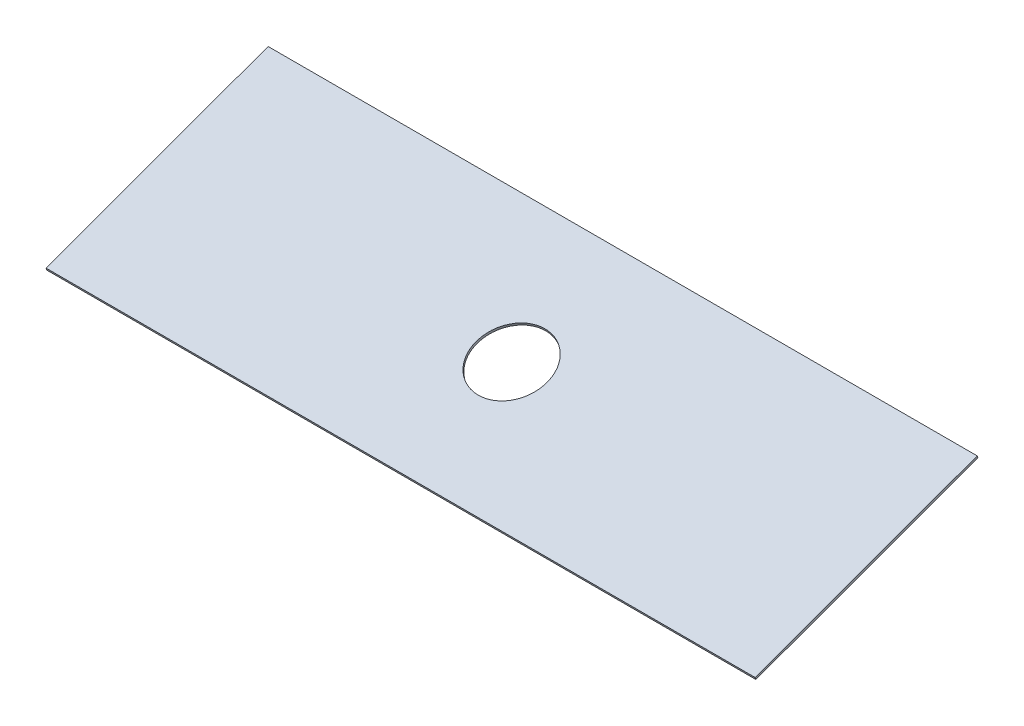
ISO-10303-21;
HEADER;
FILE_DESCRIPTION(('STEP AP214'),'2;1');
FILE_NAME('part.step','',(''),(''),'','','');
FILE_SCHEMA(('AUTOMOTIVE_DESIGN { 1 0 10303 214 1 1 1 1 }'));
ENDSEC;
DATA;
#1=APPLICATION_CONTEXT('core data for automotive mechanical design processes');
#2=APPLICATION_PROTOCOL_DEFINITION('international standard','automotive_design',2000,#1);
#3=PRODUCT_CONTEXT('',#1,'mechanical');
#4=PRODUCT('Part','Part','',(#3));
#5=PRODUCT_RELATED_PRODUCT_CATEGORY('part','',(#4));
#6=PRODUCT_DEFINITION_FORMATION('','',#4);
#7=PRODUCT_DEFINITION_CONTEXT('part definition',#1,'design');
#8=PRODUCT_DEFINITION('design','',#6,#7);
#9=PRODUCT_DEFINITION_SHAPE('','',#8);
#10=(LENGTH_UNIT() NAMED_UNIT(*) SI_UNIT(.MILLI.,.METRE.));
#11=(NAMED_UNIT(*) PLANE_ANGLE_UNIT() SI_UNIT($,.RADIAN.));
#12=(NAMED_UNIT(*) SI_UNIT($,.STERADIAN.) SOLID_ANGLE_UNIT());
#13=UNCERTAINTY_MEASURE_WITH_UNIT(LENGTH_MEASURE(1.E-05),#10,'distance_accuracy_value','');
#14=(GEOMETRIC_REPRESENTATION_CONTEXT(3) GLOBAL_UNCERTAINTY_ASSIGNED_CONTEXT((#13)) GLOBAL_UNIT_ASSIGNED_CONTEXT((#10,
#11,#12)) REPRESENTATION_CONTEXT('',''));
#15=CARTESIAN_POINT('',(0.,0.,0.));
#16=DIRECTION('',(0.,0.,1.));
#17=DIRECTION('',(1.,0.,0.));
#18=AXIS2_PLACEMENT_3D('',#15,#16,#17);
#19=CARTESIAN_POINT('',(0.,-12.220017949166,-1.95666457193581));
#20=DIRECTION('',(-1.,0.,0.));
#21=DIRECTION('',(0.,0.342020143325666,-0.93969262078591));
#22=AXIS2_PLACEMENT_3D('',#19,#20,#21);
#23=PLANE('',#22);
#24=DIRECTION('',(0.,-0.939692620785909,-0.342020143325666));
#25=VECTOR('',#24,1.);
#26=CARTESIAN_POINT('',(0.,-15.6402193824227,7.44026163592329));
#27=LINE('',#26,#25);
#28=CARTESIAN_POINT('',(0.,-15.5462501203441,7.47446365025586));
#29=VERTEX_POINT('',#28);
#30=CARTESIAN_POINT('',(0.,-15.6402193824227,7.44026163592329));
#31=VERTEX_POINT('',#30);
#32=EDGE_CURVE('E11',#29,#31,#27,.T.);
#33=ORIENTED_EDGE('',*,*,#32,.F.);
#34=DIRECTION('',(0.,0.342020143325666,-0.93969262078591));
#35=VECTOR('',#34,1.);
#36=CARTESIAN_POINT('',(0.,-12.1260486870874,-1.92246255760325));
#37=LINE('',#36,#35);
#38=CARTESIAN_POINT('',(0.,-12.1260486870874,-1.92246255760325));
#39=VERTEX_POINT('',#38);
#40=EDGE_CURVE('E88',#29,#39,#37,.T.);
#41=ORIENTED_EDGE('',*,*,#40,.T.);
#42=DIRECTION('',(0.,-0.939692620785909,-0.342020143325666));
#43=VECTOR('',#42,1.);
#44=CARTESIAN_POINT('',(0.,-12.220017949166,-1.95666457193581));
#45=LINE('',#44,#43);
#46=CARTESIAN_POINT('',(0.,-12.220017949166,-1.95666457193581));
#47=VERTEX_POINT('',#46);
#48=EDGE_CURVE('E43',#39,#47,#45,.T.);
#49=ORIENTED_EDGE('',*,*,#48,.T.);
#50=DIRECTION('',(0.,0.342020143325666,-0.93969262078591));
#51=VECTOR('',#50,1.);
#52=CARTESIAN_POINT('',(0.,-12.220017949166,-1.95666457193581));
#53=LINE('',#52,#51);
#54=EDGE_CURVE('E105',#31,#47,#53,.T.);
#55=ORIENTED_EDGE('',*,*,#54,.F.);
#56=EDGE_LOOP('',(#33,#41,#49,#55));
#57=FACE_BOUND('',#56,.T.);
#58=ADVANCED_FACE('F33',(#57),#23,.T.);
#59=CARTESIAN_POINT('',(0.,-12.220017949166,-1.95666457193581));
#60=DIRECTION('',(0.,0.342020143325666,-0.93969262078591));
#61=DIRECTION('',(1.,0.,0.));
#62=AXIS2_PLACEMENT_3D('',#59,#60,#61);
#63=PLANE('',#62);
#64=ORIENTED_EDGE('',*,*,#48,.F.);
#65=DIRECTION('',(1.,0.,0.));
#66=VECTOR('',#65,1.);
#67=CARTESIAN_POINT('',(0.,-12.1260486870874,-1.92246255760325));
#68=LINE('',#67,#66);
#69=CARTESIAN_POINT('',(30.,-12.1260486870874,-1.92246255760325));
#70=VERTEX_POINT('',#69);
#71=EDGE_CURVE('E99',#39,#70,#68,.T.);
#72=ORIENTED_EDGE('',*,*,#71,.T.);
#73=DIRECTION('',(0.,-0.939692620785909,-0.342020143325666));
#74=VECTOR('',#73,1.);
#75=CARTESIAN_POINT('',(30.,-12.220017949166,-1.95666457193581));
#76=LINE('',#75,#74);
#77=CARTESIAN_POINT('',(30.,-12.220017949166,-1.95666457193581));
#78=VERTEX_POINT('',#77);
#79=EDGE_CURVE('E51',#70,#78,#76,.T.);
#80=ORIENTED_EDGE('',*,*,#79,.T.);
#81=DIRECTION('',(1.,0.,0.));
#82=VECTOR('',#81,1.);
#83=CARTESIAN_POINT('',(0.,-12.220017949166,-1.95666457193581));
#84=LINE('',#83,#82);
#85=EDGE_CURVE('E82',#47,#78,#84,.T.);
#86=ORIENTED_EDGE('',*,*,#85,.F.);
#87=EDGE_LOOP('',(#64,#72,#80,#86));
#88=FACE_BOUND('',#87,.T.);
#89=ADVANCED_FACE('F109',(#88),#63,.T.);
#90=CARTESIAN_POINT('',(30.,-12.220017949166,-1.95666457193581));
#91=DIRECTION('',(-1.,0.,0.));
#92=DIRECTION('',(0.,0.342020143325666,-0.93969262078591));
#93=AXIS2_PLACEMENT_3D('',#90,#91,#92);
#94=PLANE('',#93);
#95=ORIENTED_EDGE('',*,*,#79,.F.);
#96=DIRECTION('',(0.,0.342020143325666,-0.93969262078591));
#97=VECTOR('',#96,1.);
#98=CARTESIAN_POINT('',(30.,-12.1260486870874,-1.92246255760325));
#99=LINE('',#98,#97);
#100=CARTESIAN_POINT('',(30.,-15.5462501203441,7.47446365025586));
#101=VERTEX_POINT('',#100);
#102=EDGE_CURVE('E87',#101,#70,#99,.T.);
#103=ORIENTED_EDGE('',*,*,#102,.F.);
#104=DIRECTION('',(0.,-0.939692620785909,-0.342020143325666));
#105=VECTOR('',#104,1.);
#106=CARTESIAN_POINT('',(30.,-15.6402193824227,7.44026163592329));
#107=LINE('',#106,#105);
#108=CARTESIAN_POINT('',(30.,-15.6402193824227,7.44026163592329));
#109=VERTEX_POINT('',#108);
#110=EDGE_CURVE('E37',#101,#109,#107,.T.);
#111=ORIENTED_EDGE('',*,*,#110,.T.);
#112=DIRECTION('',(0.,0.342020143325666,-0.93969262078591));
#113=VECTOR('',#112,1.);
#114=CARTESIAN_POINT('',(30.,-12.220017949166,-1.95666457193581));
#115=LINE('',#114,#113);
#116=EDGE_CURVE('E101',#109,#78,#115,.T.);
#117=ORIENTED_EDGE('',*,*,#116,.T.);
#118=EDGE_LOOP('',(#95,#103,#111,#117));
#119=FACE_BOUND('',#118,.T.);
#120=ADVANCED_FACE('F90',(#119),#94,.F.);
#121=CARTESIAN_POINT('',(0.,-15.6402193824227,7.44026163592329));
#122=DIRECTION('',(0.,0.342020143325666,-0.93969262078591));
#123=DIRECTION('',(1.,0.,0.));
#124=AXIS2_PLACEMENT_3D('',#121,#122,#123);
#125=PLANE('',#124);
#126=DIRECTION('',(1.,0.,0.));
#127=VECTOR('',#126,1.);
#128=CARTESIAN_POINT('',(0.,-15.5462501203441,7.47446365025586));
#129=LINE('',#128,#127);
#130=EDGE_CURVE('E76',#29,#101,#129,.T.);
#131=ORIENTED_EDGE('',*,*,#130,.F.);
#132=ORIENTED_EDGE('',*,*,#32,.T.);
#133=DIRECTION('',(1.,0.,0.));
#134=VECTOR('',#133,1.);
#135=CARTESIAN_POINT('',(0.,-15.6402193824227,7.44026163592329));
#136=LINE('',#135,#134);
#137=EDGE_CURVE('E78',#31,#109,#136,.T.);
#138=ORIENTED_EDGE('',*,*,#137,.T.);
#139=ORIENTED_EDGE('',*,*,#110,.F.);
#140=EDGE_LOOP('',(#131,#132,#138,#139));
#141=FACE_BOUND('',#140,.T.);
#142=ADVANCED_FACE('F35',(#141),#125,.F.);
#143=CARTESIAN_POINT('',(0.,-12.220017949166,-1.95666457193581));
#144=DIRECTION('',(0.,-0.939692620785909,-0.342020143325666));
#145=DIRECTION('',(0.,0.342020143325666,-0.93969262078591));
#146=AXIS2_PLACEMENT_3D('',#143,#144,#145);
#147=PLANE('',#146);
#148=CARTESIAN_POINT('',(15.,-13.9301186657943,2.74179853199374));
#149=DIRECTION('',(0.,-0.939692620785909,-0.342020143325666));
#150=DIRECTION('',(0.,0.342020143325666,-0.93969262078591));
#151=AXIS2_PLACEMENT_3D('',#148,#149,#150);
#152=CIRCLE('',#151,1.5);
#153=CARTESIAN_POINT('',(15.,-14.4431488807828,4.15133746317261));
#154=VERTEX_POINT('',#153);
#155=EDGE_CURVE('E94',#154,#154,#152,.F.);
#156=ORIENTED_EDGE('',*,*,#155,.T.);
#157=EDGE_LOOP('',(#156));
#158=FACE_BOUND('',#157,.T.);
#159=ORIENTED_EDGE('',*,*,#116,.F.);
#160=ORIENTED_EDGE('',*,*,#137,.F.);
#161=ORIENTED_EDGE('',*,*,#54,.T.);
#162=ORIENTED_EDGE('',*,*,#85,.T.);
#163=EDGE_LOOP('',(#159,#160,#161,#162));
#164=FACE_BOUND('',#163,.T.);
#165=ADVANCED_FACE('F108',(#158,#164),#147,.T.);
#166=CARTESIAN_POINT('',(0.,-12.1260486870874,-1.92246255760325));
#167=DIRECTION('',(0.,-0.939692620785909,-0.342020143325666));
#168=DIRECTION('',(0.,0.342020143325666,-0.93969262078591));
#169=AXIS2_PLACEMENT_3D('',#166,#167,#168);
#170=PLANE('',#169);
#171=CARTESIAN_POINT('',(15.,-13.8361494037157,2.77600054632631));
#172=DIRECTION('',(0.,0.939692620785909,0.342020143325666));
#173=DIRECTION('',(0.,-0.342020143325666,0.939692620785909));
#174=AXIS2_PLACEMENT_3D('',#171,#172,#173);
#175=CIRCLE('',#174,1.5);
#176=CARTESIAN_POINT('',(15.,-14.3491796187042,4.18553947750517));
#177=VERTEX_POINT('',#176);
#178=EDGE_CURVE('E91',#177,#177,#175,.T.);
#179=ORIENTED_EDGE('',*,*,#178,.F.);
#180=EDGE_LOOP('',(#179));
#181=FACE_BOUND('',#180,.T.);
#182=ORIENTED_EDGE('',*,*,#102,.T.);
#183=ORIENTED_EDGE('',*,*,#71,.F.);
#184=ORIENTED_EDGE('',*,*,#40,.F.);
#185=ORIENTED_EDGE('',*,*,#130,.T.);
#186=EDGE_LOOP('',(#182,#183,#184,#185));
#187=FACE_BOUND('',#186,.T.);
#188=ADVANCED_FACE('F85',(#181,#187),#170,.F.);
#189=CARTESIAN_POINT('',(15.,-49.263358322222,-10.11844898314));
#190=DIRECTION('',(0.,0.939692620785909,0.342020143325666));
#191=DIRECTION('',(0.,-0.342020143325666,0.939692620785909));
#192=AXIS2_PLACEMENT_3D('',#189,#190,#191);
#193=CYLINDRICAL_SURFACE('',#192,1.5);
#194=CARTESIAN_POINT('',(15.,-14.4431488807828,4.15133746317261));
#195=CARTESIAN_POINT('',(15.,-14.4421700343028,4.15169373415524));
#196=CARTESIAN_POINT('',(15.,-14.4411911878228,4.15205000513787));
#197=CARTESIAN_POINT('',(15.,-14.4392334948629,4.15276254710313));
#198=CARTESIAN_POINT('',(15.,-14.4382546483829,4.15311881808576));
#199=CARTESIAN_POINT('',(15.,-14.4362969554229,4.15383136005102));
#200=CARTESIAN_POINT('',(15.,-14.4353181089429,4.15418763103365));
#201=CARTESIAN_POINT('',(15.,-14.433360415983,4.15490017299891));
#202=CARTESIAN_POINT('',(15.,-14.432381569503,4.15525644398155));
#203=CARTESIAN_POINT('',(15.,-14.430423876543,4.15596898594681));
#204=CARTESIAN_POINT('',(15.,-14.429445030063,4.15632525692944));
#205=CARTESIAN_POINT('',(15.,-14.4274873371031,4.1570377988947));
#206=CARTESIAN_POINT('',(15.,-14.4265084906231,4.15739406987733));
#207=CARTESIAN_POINT('',(15.,-14.4245507976631,4.15810661184259));
#208=CARTESIAN_POINT('',(15.,-14.4235719511831,4.15846288282522));
#209=CARTESIAN_POINT('',(15.,-14.4216142582231,4.15917542479048));
#210=CARTESIAN_POINT('',(15.,-14.4206354117432,4.15953169577311));
#211=CARTESIAN_POINT('',(15.,-14.4186777187832,4.16024423773838));
#212=CARTESIAN_POINT('',(15.,-14.4176988723032,4.16060050872101));
#213=CARTESIAN_POINT('',(15.,-14.4157411793432,4.16131305068627));
#214=CARTESIAN_POINT('',(15.,-14.4147623328632,4.1616693216689));
#215=CARTESIAN_POINT('',(15.,-14.4128046399033,4.16238186363416));
#216=CARTESIAN_POINT('',(15.,-14.4118257934233,4.16273813461679));
#217=CARTESIAN_POINT('',(15.,-14.4098681004633,4.16345067658206));
#218=CARTESIAN_POINT('',(15.,-14.4088892539833,4.16380694756469));
#219=CARTESIAN_POINT('',(15.,-14.4069315610234,4.16451948952995));
#220=CARTESIAN_POINT('',(15.,-14.4059527145434,4.16487576051258));
#221=CARTESIAN_POINT('',(15.,-14.4039950215834,4.16558830247784));
#222=CARTESIAN_POINT('',(15.,-14.4030161751034,4.16594457346047));
#223=CARTESIAN_POINT('',(15.,-14.4010584821435,4.16665711542573));
#224=CARTESIAN_POINT('',(15.,-14.4000796356635,4.16701338640836));
#225=CARTESIAN_POINT('',(15.,-14.3981219427035,4.16772592837363));
#226=CARTESIAN_POINT('',(15.,-14.3971430962235,4.16808219935626));
#227=CARTESIAN_POINT('',(15.,-14.3951854032635,4.16879474132152));
#228=CARTESIAN_POINT('',(15.,-14.3942065567836,4.16915101230415));
#229=CARTESIAN_POINT('',(15.,-14.3922488638236,4.16986355426941));
#230=CARTESIAN_POINT('',(15.,-14.3912700173436,4.17021982525204));
#231=CARTESIAN_POINT('',(15.,-14.3893123243836,4.1709323672173));
#232=CARTESIAN_POINT('',(15.,-14.3883334779036,4.17128863819993));
#233=CARTESIAN_POINT('',(15.,-14.3863757849437,4.1720011801652));
#234=CARTESIAN_POINT('',(15.,-14.3853969384637,4.17235745114783));
#235=CARTESIAN_POINT('',(15.,-14.3834392455037,4.17306999311309));
#236=CARTESIAN_POINT('',(15.,-14.3824603990237,4.17342626409572));
#237=CARTESIAN_POINT('',(15.,-14.3805027060638,4.17413880606098));
#238=CARTESIAN_POINT('',(15.,-14.3795238595838,4.17449507704361));
#239=CARTESIAN_POINT('',(15.,-14.3775661666238,4.17520761900887));
#240=CARTESIAN_POINT('',(15.,-14.3765873201438,4.1755638899915));
#241=CARTESIAN_POINT('',(15.,-14.3746296271839,4.17627643195677));
#242=CARTESIAN_POINT('',(15.,-14.3736507807039,4.1766327029394));
#243=CARTESIAN_POINT('',(15.,-14.3716930877439,4.17734524490466));
#244=CARTESIAN_POINT('',(15.,-14.3707142412639,4.17770151588729));
#245=CARTESIAN_POINT('',(15.,-14.3687565483039,4.17841405785255));
#246=CARTESIAN_POINT('',(15.,-14.367777701824,4.17877032883518));
#247=CARTESIAN_POINT('',(15.,-14.365820008864,4.17948287080044));
#248=CARTESIAN_POINT('',(15.,-14.364841162384,4.17983914178308));
#249=CARTESIAN_POINT('',(15.,-14.362883469424,4.18055168374834));
#250=CARTESIAN_POINT('',(15.,-14.361904622944,4.18090795473097));
#251=CARTESIAN_POINT('',(15.,-14.3599469299841,4.18162049669623));
#252=CARTESIAN_POINT('',(15.,-14.3589680835041,4.18197676767886));
#253=CARTESIAN_POINT('',(15.,-14.3570103905441,4.18268930964412));
#254=CARTESIAN_POINT('',(15.,-14.3560315440641,4.18304558062675));
#255=CARTESIAN_POINT('',(15.,-14.3540738511042,4.18375812259201));
#256=CARTESIAN_POINT('',(15.,-14.3530950046242,4.18411439357465));
#257=CARTESIAN_POINT('',(15.,-14.3511373116642,4.18482693553991));
#258=CARTESIAN_POINT('',(15.,-14.3501584651842,4.18518320652254));
#259=CARTESIAN_POINT('',(15.,-14.3491796187042,4.18553947750517));
#260=B_SPLINE_CURVE_WITH_KNOTS('',3,(#194,#195,#196,#197,#198,#199,#200,#201,#202,#203,#204,
#205,#206,#207,#208,#209,#210,#211,#212,#213,#214,#215,#216,#217,#218,#219,#220,#221,#222,#223,
#224,#225,#226,#227,#228,#229,#230,#231,#232,#233,#234,#235,#236,#237,#238,#239,#240,#241,#242,
#243,#244,#245,#246,#247,#248,#249,#250,#251,#252,#253,#254,#255,#256,#257,#258,#259),
.UNSPECIFIED.,.F.,.F.,(4,2,2,2,2,2,2,2,2,2,2,2,2,2,2,2,2,2,2,2,2,2,2,2,2,2,2,2,2,2,2,2,4),(0.,
0.00312499999999732,0.00625000000000116,0.00937499999999789,0.0124999999999952,
0.0156249999999991,0.0187499999999964,0.0218749999999937,0.0249999999999969,0.0281249999999943,
0.0312499999999981,0.0343749999999954,0.0374999999999928,0.040624999999996,0.0437499999999933,
0.0468749999999907,0.0499999999999945,0.0531249999999918,0.0562499999999951,0.0593749999999924,
0.0624999999999897,0.0656249999999936,0.0687499999999909,0.0718749999999876,0.0749999999999914,
0.0781249999999888,0.0812499999999926,0.0843749999999899,0.0874999999999867,0.0906249999999905,
0.0937499999999878,0.0968749999999852,0.099999999999989),.UNSPECIFIED.);
#261=EDGE_CURVE('BSEAM117',#154,#177,#260,.T.);
#262=ORIENTED_EDGE('',*,*,#155,.F.);
#263=ORIENTED_EDGE('',*,*,#178,.T.);
#264=ORIENTED_EDGE('',*,*,#261,.T.);
#265=ORIENTED_EDGE('',*,*,#261,.F.);
#266=EDGE_LOOP('',(#262,#264,#263,#265));
#267=FACE_BOUND('',#266,.T.);
#268=ADVANCED_FACE('F117',(#267),#193,.F.);
#269=CLOSED_SHELL('',(#58,#89,#120,#142,#165,#188,#268));
#270=MANIFOLD_SOLID_BREP('B2',#269);
#271=ADVANCED_BREP_SHAPE_REPRESENTATION('',(#18,#270),#14);
#272=SHAPE_DEFINITION_REPRESENTATION(#9,#271);
ENDSEC;
END-ISO-10303-21;
